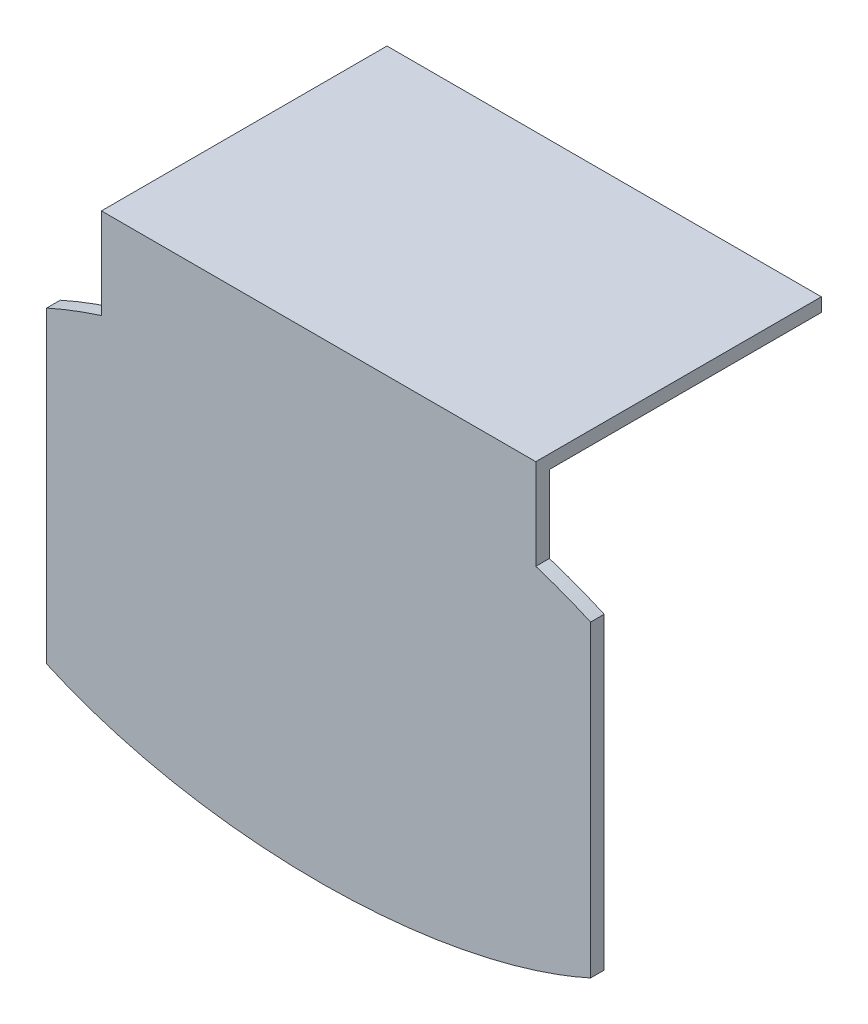
ISO-10303-21;
HEADER;
FILE_DESCRIPTION(('STEP AP214'),'2;1');
FILE_NAME('part.step','',(''),(''),'','','');
FILE_SCHEMA(('AUTOMOTIVE_DESIGN { 1 0 10303 214 1 1 1 1 }'));
ENDSEC;
DATA;
#1=APPLICATION_CONTEXT('core data for automotive mechanical design processes');
#2=APPLICATION_PROTOCOL_DEFINITION('international standard','automotive_design',2000,#1);
#3=PRODUCT_CONTEXT('',#1,'mechanical');
#4=PRODUCT('Part','Part','',(#3));
#5=PRODUCT_RELATED_PRODUCT_CATEGORY('part','',(#4));
#6=PRODUCT_DEFINITION_FORMATION('','',#4);
#7=PRODUCT_DEFINITION_CONTEXT('part definition',#1,'design');
#8=PRODUCT_DEFINITION('design','',#6,#7);
#9=PRODUCT_DEFINITION_SHAPE('','',#8);
#10=(LENGTH_UNIT() NAMED_UNIT(*) SI_UNIT(.MILLI.,.METRE.));
#11=(NAMED_UNIT(*) PLANE_ANGLE_UNIT() SI_UNIT($,.RADIAN.));
#12=(NAMED_UNIT(*) SI_UNIT($,.STERADIAN.) SOLID_ANGLE_UNIT());
#13=UNCERTAINTY_MEASURE_WITH_UNIT(LENGTH_MEASURE(1.E-05),#10,'distance_accuracy_value','');
#14=(GEOMETRIC_REPRESENTATION_CONTEXT(3) GLOBAL_UNCERTAINTY_ASSIGNED_CONTEXT((#13)) GLOBAL_UNIT_ASSIGNED_CONTEXT((#10,
#11,#12)) REPRESENTATION_CONTEXT('',''));
#15=CARTESIAN_POINT('',(0.,0.,0.));
#16=DIRECTION('',(0.,0.,1.));
#17=DIRECTION('',(1.,0.,0.));
#18=AXIS2_PLACEMENT_3D('',#15,#16,#17);
#19=CARTESIAN_POINT('',(0.,0.,0.));
#20=DIRECTION('',(0.,0.,1.));
#21=DIRECTION('',(1.,0.,0.));
#22=AXIS2_PLACEMENT_3D('',#19,#20,#21);
#23=PLANE('',#22);
#24=DIRECTION('',(-1.,0.,0.));
#25=VECTOR('',#24,1.);
#26=CARTESIAN_POINT('',(-47.9144429524169,55.608895735436,0.));
#27=LINE('',#26,#25);
#28=CARTESIAN_POINT('',(47.914442952417,55.608895735436,0.));
#29=VERTEX_POINT('',#28);
#30=CARTESIAN_POINT('',(-47.9144429524169,55.608895735436,0.));
#31=VERTEX_POINT('',#30);
#32=EDGE_CURVE('E50',#29,#31,#27,.T.);
#33=ORIENTED_EDGE('',*,*,#32,.F.);
#34=DIRECTION('',(0.,-1.,0.));
#35=VECTOR('',#34,1.);
#36=CARTESIAN_POINT('',(47.914442952417,58.608895735436,0.));
#37=LINE('',#36,#35);
#38=CARTESIAN_POINT('',(47.914442952417,38.608895735436,0.));
#39=VERTEX_POINT('',#38);
#40=EDGE_CURVE('E134',#29,#39,#37,.T.);
#41=ORIENTED_EDGE('',*,*,#40,.T.);
#42=CARTESIAN_POINT('',(0.,0.,0.));
#43=DIRECTION('',(0.,0.,1.));
#44=DIRECTION('',(-1.,0.,0.));
#45=AXIS2_PLACEMENT_3D('',#42,#43,#44);
#46=ELLIPSE('',#45,90.0290737604365,45.6040083703004);
#47=CARTESIAN_POINT('',(59.9999999999998,34.0000000000001,0.));
#48=VERTEX_POINT('',#47);
#49=EDGE_CURVE('E306',#48,#39,#46,.T.);
#50=ORIENTED_EDGE('',*,*,#49,.F.);
#51=DIRECTION('',(0.,1.,0.));
#52=VECTOR('',#51,1.);
#53=CARTESIAN_POINT('',(59.9999999999998,34.0000000000001,0.));
#54=LINE('',#53,#52);
#55=CARTESIAN_POINT('',(59.9999999999998,-34.0000000000001,0.));
#56=VERTEX_POINT('',#55);
#57=EDGE_CURVE('E294',#56,#48,#54,.T.);
#58=ORIENTED_EDGE('',*,*,#57,.F.);
#59=CARTESIAN_POINT('',(0.,0.,0.));
#60=DIRECTION('',(0.,0.,1.));
#61=DIRECTION('',(-1.,0.,0.));
#62=AXIS2_PLACEMENT_3D('',#59,#60,#61);
#63=ELLIPSE('',#62,90.0290737604365,45.6040083703004);
#64=CARTESIAN_POINT('',(-60.,-34.,0.));
#65=VERTEX_POINT('',#64);
#66=EDGE_CURVE('E303',#65,#56,#63,.T.);
#67=ORIENTED_EDGE('',*,*,#66,.F.);
#68=DIRECTION('',(0.,-1.,0.));
#69=VECTOR('',#68,1.);
#70=CARTESIAN_POINT('',(-60.,34.,0.));
#71=LINE('',#70,#69);
#72=CARTESIAN_POINT('',(-60.,34.,0.));
#73=VERTEX_POINT('',#72);
#74=EDGE_CURVE('E308',#73,#65,#71,.T.);
#75=ORIENTED_EDGE('',*,*,#74,.F.);
#76=CARTESIAN_POINT('',(-47.9144429524169,38.608895735436,0.));
#77=VERTEX_POINT('',#76);
#78=EDGE_CURVE('E155',#77,#73,#46,.T.);
#79=ORIENTED_EDGE('',*,*,#78,.F.);
#80=DIRECTION('',(0.,-1.,0.));
#81=VECTOR('',#80,1.);
#82=CARTESIAN_POINT('',(-47.9144429524169,58.608895735436,0.));
#83=LINE('',#82,#81);
#84=EDGE_CURVE('E150',#31,#77,#83,.T.);
#85=ORIENTED_EDGE('',*,*,#84,.F.);
#86=EDGE_LOOP('',(#33,#41,#50,#58,#67,#75,#79,#85));
#87=FACE_BOUND('',#86,.T.);
#88=ADVANCED_FACE('F34',(#87),#23,.F.);
#89=CARTESIAN_POINT('',(0.,0.,3.));
#90=DIRECTION('',(0.,0.,1.));
#91=DIRECTION('',(-1.,0.,0.));
#92=AXIS2_PLACEMENT_3D('',#89,#90,#91);
#93=ELLIPSE('',#92,90.0290737604365,45.6040083703004);
#94=DIRECTION('',(0.,0.,-1.));
#95=VECTOR('',#94,1.);
#96=SURFACE_OF_LINEAR_EXTRUSION('',#93,#95);
#97=DIRECTION('',(0.,0.,1.));
#98=VECTOR('',#97,1.);
#99=CARTESIAN_POINT('',(-47.9144429524169,38.608895735436,-188.447200487272));
#100=LINE('',#99,#98);
#101=CARTESIAN_POINT('',(-47.9144429524169,38.608895735436,3.));
#102=VERTEX_POINT('',#101);
#103=EDGE_CURVE('E154',#77,#102,#100,.T.);
#104=ORIENTED_EDGE('',*,*,#103,.F.);
#105=ORIENTED_EDGE('',*,*,#78,.T.);
#106=DIRECTION('',(0.,0.,-1.));
#107=VECTOR('',#106,1.);
#108=CARTESIAN_POINT('',(-60.,34.,3.));
#109=LINE('',#108,#107);
#110=CARTESIAN_POINT('',(-60.,34.,3.));
#111=VERTEX_POINT('',#110);
#112=EDGE_CURVE('E11',#111,#73,#109,.T.);
#113=ORIENTED_EDGE('',*,*,#112,.F.);
#114=EDGE_CURVE('E161',#102,#111,#93,.T.);
#115=ORIENTED_EDGE('',*,*,#114,.F.);
#116=EDGE_LOOP('',(#104,#105,#113,#115));
#117=FACE_BOUND('',#116,.T.);
#118=ADVANCED_FACE('F36',(#117),#96,.F.);
#119=DIRECTION('',(0.,0.,1.));
#120=VECTOR('',#119,1.);
#121=CARTESIAN_POINT('',(47.914442952417,38.608895735436,-188.447200487272));
#122=LINE('',#121,#120);
#123=CARTESIAN_POINT('',(47.914442952417,38.608895735436,3.));
#124=VERTEX_POINT('',#123);
#125=EDGE_CURVE('E152',#39,#124,#122,.T.);
#126=ORIENTED_EDGE('',*,*,#125,.T.);
#127=CARTESIAN_POINT('',(59.9999999999998,34.0000000000001,3.));
#128=VERTEX_POINT('',#127);
#129=EDGE_CURVE('E156',#128,#124,#93,.T.);
#130=ORIENTED_EDGE('',*,*,#129,.F.);
#131=DIRECTION('',(0.,0.,-1.));
#132=VECTOR('',#131,1.);
#133=CARTESIAN_POINT('',(59.9999999999998,34.0000000000001,3.));
#134=LINE('',#133,#132);
#135=EDGE_CURVE('E297',#128,#48,#134,.T.);
#136=ORIENTED_EDGE('',*,*,#135,.T.);
#137=ORIENTED_EDGE('',*,*,#49,.T.);
#138=EDGE_LOOP('',(#126,#130,#136,#137));
#139=FACE_BOUND('',#138,.T.);
#140=ADVANCED_FACE('F177',(#139),#96,.F.);
#141=CARTESIAN_POINT('',(-60.,34.,3.));
#142=DIRECTION('',(1.,0.,0.));
#143=DIRECTION('',(0.,0.,-1.));
#144=AXIS2_PLACEMENT_3D('',#141,#142,#143);
#145=PLANE('',#144);
#146=ORIENTED_EDGE('',*,*,#74,.T.);
#147=DIRECTION('',(0.,0.,-1.));
#148=VECTOR('',#147,1.);
#149=CARTESIAN_POINT('',(-60.,-34.,3.));
#150=LINE('',#149,#148);
#151=CARTESIAN_POINT('',(-60.,-34.,3.));
#152=VERTEX_POINT('',#151);
#153=EDGE_CURVE('E43',#152,#65,#150,.T.);
#154=ORIENTED_EDGE('',*,*,#153,.F.);
#155=DIRECTION('',(0.,-1.,0.));
#156=VECTOR('',#155,1.);
#157=CARTESIAN_POINT('',(-60.,34.,3.));
#158=LINE('',#157,#156);
#159=EDGE_CURVE('E160',#111,#152,#158,.T.);
#160=ORIENTED_EDGE('',*,*,#159,.F.);
#161=ORIENTED_EDGE('',*,*,#112,.T.);
#162=EDGE_LOOP('',(#146,#154,#160,#161));
#163=FACE_BOUND('',#162,.T.);
#164=ADVANCED_FACE('F173',(#163),#145,.F.);
#165=CARTESIAN_POINT('',(0.,0.,3.));
#166=DIRECTION('',(0.,0.,1.));
#167=DIRECTION('',(-1.,0.,0.));
#168=AXIS2_PLACEMENT_3D('',#165,#166,#167);
#169=ELLIPSE('',#168,90.0290737604365,45.6040083703004);
#170=DIRECTION('',(0.,0.,-1.));
#171=VECTOR('',#170,1.);
#172=SURFACE_OF_LINEAR_EXTRUSION('',#169,#171);
#173=ORIENTED_EDGE('',*,*,#66,.T.);
#174=DIRECTION('',(0.,0.,-1.));
#175=VECTOR('',#174,1.);
#176=CARTESIAN_POINT('',(59.9999999999998,-34.0000000000001,3.));
#177=LINE('',#176,#175);
#178=CARTESIAN_POINT('',(59.9999999999998,-34.0000000000001,3.));
#179=VERTEX_POINT('',#178);
#180=EDGE_CURVE('E300',#179,#56,#177,.T.);
#181=ORIENTED_EDGE('',*,*,#180,.F.);
#182=EDGE_CURVE('E163',#152,#179,#169,.T.);
#183=ORIENTED_EDGE('',*,*,#182,.F.);
#184=ORIENTED_EDGE('',*,*,#153,.T.);
#185=EDGE_LOOP('',(#173,#181,#183,#184));
#186=FACE_BOUND('',#185,.T.);
#187=ADVANCED_FACE('F169',(#186),#172,.F.);
#188=CARTESIAN_POINT('',(59.9999999999998,34.0000000000001,3.));
#189=DIRECTION('',(-1.,0.,0.));
#190=DIRECTION('',(0.,-1.,0.));
#191=AXIS2_PLACEMENT_3D('',#188,#189,#190);
#192=PLANE('',#191);
#193=ORIENTED_EDGE('',*,*,#57,.T.);
#194=ORIENTED_EDGE('',*,*,#135,.F.);
#195=DIRECTION('',(0.,1.,0.));
#196=VECTOR('',#195,1.);
#197=CARTESIAN_POINT('',(59.9999999999998,34.0000000000001,3.));
#198=LINE('',#197,#196);
#199=EDGE_CURVE('E166',#179,#128,#198,.T.);
#200=ORIENTED_EDGE('',*,*,#199,.F.);
#201=ORIENTED_EDGE('',*,*,#180,.T.);
#202=EDGE_LOOP('',(#193,#194,#200,#201));
#203=FACE_BOUND('',#202,.T.);
#204=ADVANCED_FACE('F172',(#203),#192,.F.);
#205=CARTESIAN_POINT('',(0.,0.,3.));
#206=DIRECTION('',(0.,0.,1.));
#207=DIRECTION('',(1.,0.,0.));
#208=AXIS2_PLACEMENT_3D('',#205,#206,#207);
#209=PLANE('',#208);
#210=ORIENTED_EDGE('',*,*,#129,.T.);
#211=DIRECTION('',(0.,-1.,0.));
#212=VECTOR('',#211,1.);
#213=CARTESIAN_POINT('',(47.914442952417,58.608895735436,3.));
#214=LINE('',#213,#212);
#215=CARTESIAN_POINT('',(47.914442952417,58.608895735436,3.));
#216=VERTEX_POINT('',#215);
#217=EDGE_CURVE('E58',#216,#124,#214,.T.);
#218=ORIENTED_EDGE('',*,*,#217,.F.);
#219=DIRECTION('',(1.,0.,0.));
#220=VECTOR('',#219,1.);
#221=CARTESIAN_POINT('',(-47.9144429524169,58.608895735436,3.));
#222=LINE('',#221,#220);
#223=CARTESIAN_POINT('',(-47.9144429524169,58.608895735436,3.));
#224=VERTEX_POINT('',#223);
#225=EDGE_CURVE('E137',#224,#216,#222,.T.);
#226=ORIENTED_EDGE('',*,*,#225,.F.);
#227=DIRECTION('',(0.,-1.,0.));
#228=VECTOR('',#227,1.);
#229=CARTESIAN_POINT('',(-47.9144429524169,58.608895735436,3.));
#230=LINE('',#229,#228);
#231=EDGE_CURVE('E147',#224,#102,#230,.T.);
#232=ORIENTED_EDGE('',*,*,#231,.T.);
#233=ORIENTED_EDGE('',*,*,#114,.T.);
#234=ORIENTED_EDGE('',*,*,#159,.T.);
#235=ORIENTED_EDGE('',*,*,#182,.T.);
#236=ORIENTED_EDGE('',*,*,#199,.T.);
#237=EDGE_LOOP('',(#210,#218,#226,#232,#233,#234,#235,#236));
#238=FACE_BOUND('',#237,.T.);
#239=ADVANCED_FACE('F189',(#238),#209,.T.);
#240=CARTESIAN_POINT('',(-47.9144429524169,58.608895735436,0.));
#241=DIRECTION('',(1.,0.,0.));
#242=DIRECTION('',(0.,0.,-1.));
#243=AXIS2_PLACEMENT_3D('',#240,#241,#242);
#244=PLANE('',#243);
#245=ORIENTED_EDGE('',*,*,#103,.T.);
#246=ORIENTED_EDGE('',*,*,#231,.F.);
#247=DIRECTION('',(0.,0.,1.));
#248=VECTOR('',#247,1.);
#249=CARTESIAN_POINT('',(-47.9144429524169,58.608895735436,0.));
#250=LINE('',#249,#248);
#251=CARTESIAN_POINT('',(-47.9144429524169,58.608895735436,-60.));
#252=VERTEX_POINT('',#251);
#253=EDGE_CURVE('E135',#252,#224,#250,.T.);
#254=ORIENTED_EDGE('',*,*,#253,.F.);
#255=DIRECTION('',(0.,1.,0.));
#256=VECTOR('',#255,1.);
#257=CARTESIAN_POINT('',(-47.9144429524169,58.608895735436,-60.));
#258=LINE('',#257,#256);
#259=CARTESIAN_POINT('',(-47.9144429524169,55.608895735436,-60.));
#260=VERTEX_POINT('',#259);
#261=EDGE_CURVE('E124',#260,#252,#258,.T.);
#262=ORIENTED_EDGE('',*,*,#261,.F.);
#263=DIRECTION('',(0.,0.,1.));
#264=VECTOR('',#263,1.);
#265=CARTESIAN_POINT('',(-47.9144429524169,55.608895735436,-60.));
#266=LINE('',#265,#264);
#267=EDGE_CURVE('E120',#260,#31,#266,.T.);
#268=ORIENTED_EDGE('',*,*,#267,.T.);
#269=ORIENTED_EDGE('',*,*,#84,.T.);
#270=EDGE_LOOP('',(#245,#246,#254,#262,#268,#269));
#271=FACE_BOUND('',#270,.T.);
#272=ADVANCED_FACE('F192',(#271),#244,.F.);
#273=CARTESIAN_POINT('',(47.914442952417,58.608895735436,3.));
#274=DIRECTION('',(-1.,0.,0.));
#275=DIRECTION('',(0.,0.,1.));
#276=AXIS2_PLACEMENT_3D('',#273,#274,#275);
#277=PLANE('',#276);
#278=ORIENTED_EDGE('',*,*,#125,.F.);
#279=ORIENTED_EDGE('',*,*,#40,.F.);
#280=DIRECTION('',(0.,0.,1.));
#281=VECTOR('',#280,1.);
#282=CARTESIAN_POINT('',(47.914442952417,55.608895735436,-60.));
#283=LINE('',#282,#281);
#284=CARTESIAN_POINT('',(47.914442952417,55.608895735436,-60.));
#285=VERTEX_POINT('',#284);
#286=EDGE_CURVE('E118',#285,#29,#283,.T.);
#287=ORIENTED_EDGE('',*,*,#286,.F.);
#288=DIRECTION('',(0.,-1.,0.));
#289=VECTOR('',#288,1.);
#290=CARTESIAN_POINT('',(47.914442952417,55.608895735436,-60.));
#291=LINE('',#290,#289);
#292=CARTESIAN_POINT('',(47.914442952417,58.608895735436,-60.));
#293=VERTEX_POINT('',#292);
#294=EDGE_CURVE('E125',#293,#285,#291,.T.);
#295=ORIENTED_EDGE('',*,*,#294,.F.);
#296=DIRECTION('',(0.,0.,-1.));
#297=VECTOR('',#296,1.);
#298=CARTESIAN_POINT('',(47.914442952417,58.608895735436,3.));
#299=LINE('',#298,#297);
#300=EDGE_CURVE('E143',#216,#293,#299,.T.);
#301=ORIENTED_EDGE('',*,*,#300,.F.);
#302=ORIENTED_EDGE('',*,*,#217,.T.);
#303=EDGE_LOOP('',(#278,#279,#287,#295,#301,#302));
#304=FACE_BOUND('',#303,.T.);
#305=ADVANCED_FACE('F133',(#304),#277,.F.);
#306=CARTESIAN_POINT('',(0.,58.608895735436,0.));
#307=DIRECTION('',(0.,1.,0.));
#308=DIRECTION('',(0.,0.,1.));
#309=AXIS2_PLACEMENT_3D('',#306,#307,#308);
#310=PLANE('',#309);
#311=ORIENTED_EDGE('',*,*,#300,.T.);
#312=DIRECTION('',(1.,0.,0.));
#313=VECTOR('',#312,1.);
#314=CARTESIAN_POINT('',(47.914442952417,58.608895735436,-60.));
#315=LINE('',#314,#313);
#316=EDGE_CURVE('E131',#252,#293,#315,.T.);
#317=ORIENTED_EDGE('',*,*,#316,.F.);
#318=ORIENTED_EDGE('',*,*,#253,.T.);
#319=ORIENTED_EDGE('',*,*,#225,.T.);
#320=EDGE_LOOP('',(#311,#317,#318,#319));
#321=FACE_BOUND('',#320,.T.);
#322=ADVANCED_FACE('F199',(#321),#310,.T.);
#323=CARTESIAN_POINT('',(-47.9144429524169,55.608895735436,-60.));
#324=DIRECTION('',(0.,1.,0.));
#325=DIRECTION('',(-1.,0.,0.));
#326=AXIS2_PLACEMENT_3D('',#323,#324,#325);
#327=PLANE('',#326);
#328=ORIENTED_EDGE('',*,*,#32,.T.);
#329=ORIENTED_EDGE('',*,*,#267,.F.);
#330=DIRECTION('',(-1.,0.,0.));
#331=VECTOR('',#330,1.);
#332=CARTESIAN_POINT('',(-47.9144429524169,55.608895735436,-60.));
#333=LINE('',#332,#331);
#334=EDGE_CURVE('E114',#285,#260,#333,.T.);
#335=ORIENTED_EDGE('',*,*,#334,.F.);
#336=ORIENTED_EDGE('',*,*,#286,.T.);
#337=EDGE_LOOP('',(#328,#329,#335,#336));
#338=FACE_BOUND('',#337,.T.);
#339=ADVANCED_FACE('F116',(#338),#327,.F.);
#340=CARTESIAN_POINT('',(0.,0.,-60.));
#341=DIRECTION('',(0.,0.,1.));
#342=DIRECTION('',(1.,0.,0.));
#343=AXIS2_PLACEMENT_3D('',#340,#341,#342);
#344=PLANE('',#343);
#345=ORIENTED_EDGE('',*,*,#294,.T.);
#346=ORIENTED_EDGE('',*,*,#334,.T.);
#347=ORIENTED_EDGE('',*,*,#261,.T.);
#348=ORIENTED_EDGE('',*,*,#316,.T.);
#349=EDGE_LOOP('',(#345,#346,#347,#348));
#350=FACE_BOUND('',#349,.T.);
#351=ADVANCED_FACE('F129',(#350),#344,.F.);
#352=CLOSED_SHELL('',(#88,#118,#140,#164,#187,#204,#239,#272,#305,#322,#339,#351));
#353=MANIFOLD_SOLID_BREP('B2',#352);
#354=ADVANCED_BREP_SHAPE_REPRESENTATION('',(#18,#353),#14);
#355=SHAPE_DEFINITION_REPRESENTATION(#9,#354);
ENDSEC;
END-ISO-10303-21;
